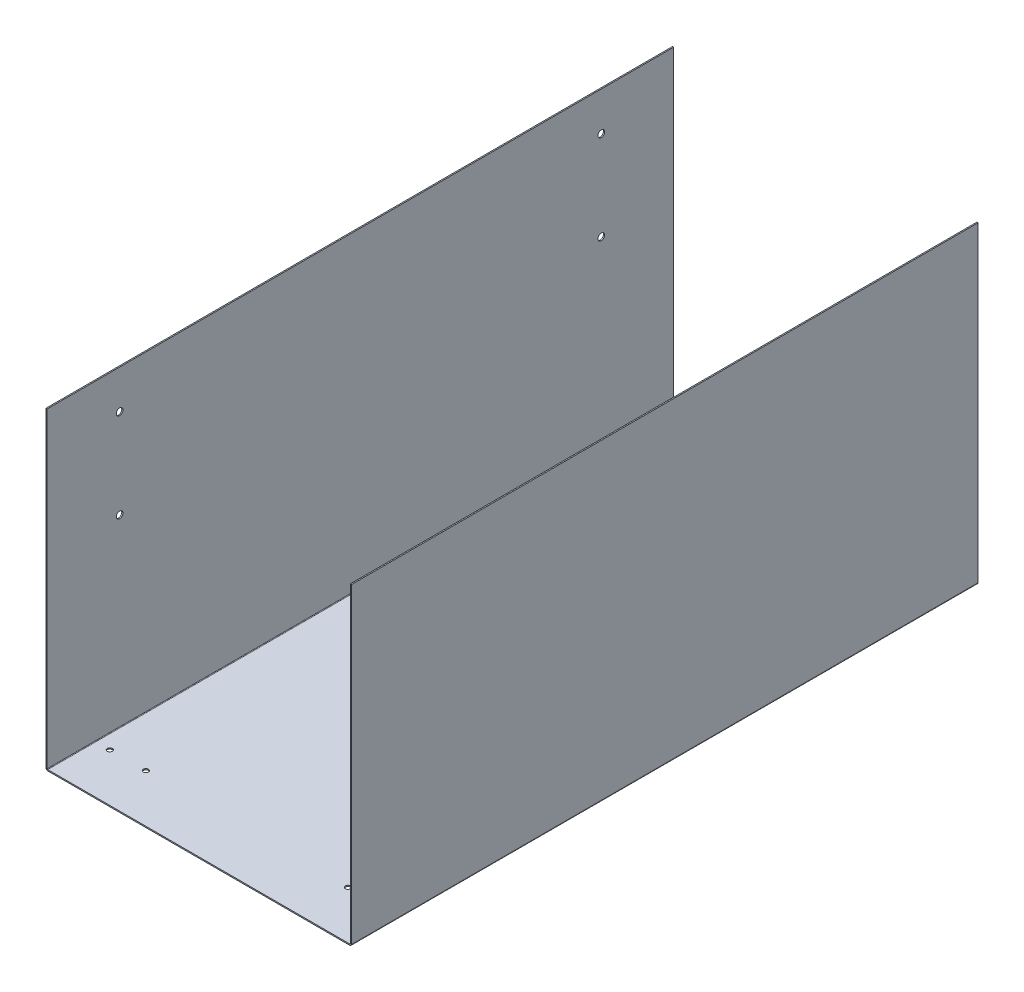
ISO-10303-21;
HEADER;
FILE_DESCRIPTION(('STEP AP214'),'2;1');
FILE_NAME('part.step','',(''),(''),'','','');
FILE_SCHEMA(('AUTOMOTIVE_DESIGN { 1 0 10303 214 1 1 1 1 }'));
ENDSEC;
DATA;
#1=APPLICATION_CONTEXT('core data for automotive mechanical design processes');
#2=APPLICATION_PROTOCOL_DEFINITION('international standard','automotive_design',2000,#1);
#3=PRODUCT_CONTEXT('',#1,'mechanical');
#4=PRODUCT('Part','Part','',(#3));
#5=PRODUCT_RELATED_PRODUCT_CATEGORY('part','',(#4));
#6=PRODUCT_DEFINITION_FORMATION('','',#4);
#7=PRODUCT_DEFINITION_CONTEXT('part definition',#1,'design');
#8=PRODUCT_DEFINITION('design','',#6,#7);
#9=PRODUCT_DEFINITION_SHAPE('','',#8);
#10=(LENGTH_UNIT() NAMED_UNIT(*) SI_UNIT(.MILLI.,.METRE.));
#11=(NAMED_UNIT(*) PLANE_ANGLE_UNIT() SI_UNIT($,.RADIAN.));
#12=(NAMED_UNIT(*) SI_UNIT($,.STERADIAN.) SOLID_ANGLE_UNIT());
#13=UNCERTAINTY_MEASURE_WITH_UNIT(LENGTH_MEASURE(1.E-05),#10,'distance_accuracy_value','');
#14=(GEOMETRIC_REPRESENTATION_CONTEXT(3) GLOBAL_UNCERTAINTY_ASSIGNED_CONTEXT((#13)) GLOBAL_UNIT_ASSIGNED_CONTEXT((#10,
#11,#12)) REPRESENTATION_CONTEXT('',''));
#15=CARTESIAN_POINT('',(0.,0.,0.));
#16=DIRECTION('',(0.,0.,1.));
#17=DIRECTION('',(1.,0.,0.));
#18=AXIS2_PLACEMENT_3D('',#15,#16,#17);
#19=CARTESIAN_POINT('',(192.7634,0.,400.));
#20=DIRECTION('',(0.,0.,1.));
#21=DIRECTION('',(1.,0.,0.));
#22=AXIS2_PLACEMENT_3D('',#19,#20,#21);
#23=PLANE('',#22);
#24=DIRECTION('',(0.,1.,0.));
#25=VECTOR('',#24,1.);
#26=CARTESIAN_POINT('',(192.7634,0.,400.));
#27=LINE('',#26,#25);
#28=CARTESIAN_POINT('',(192.7634,0.,400.));
#29=VERTEX_POINT('',#28);
#30=CARTESIAN_POINT('',(192.7634,1.50000000000007,400.));
#31=VERTEX_POINT('',#30);
#32=EDGE_CURVE('E11',#29,#31,#27,.T.);
#33=ORIENTED_EDGE('',*,*,#32,.F.);
#34=CARTESIAN_POINT('',(192.7634,2.23660000000007,400.));
#35=DIRECTION('',(0.,0.,1.));
#36=DIRECTION('',(1.,0.,0.));
#37=AXIS2_PLACEMENT_3D('',#34,#35,#36);
#38=CIRCLE('',#37,2.2366);
#39=CARTESIAN_POINT('',(195.,2.23660000000007,400.));
#40=VERTEX_POINT('',#39);
#41=EDGE_CURVE('E302',#40,#29,#38,.F.);
#42=ORIENTED_EDGE('',*,*,#41,.F.);
#43=DIRECTION('',(1.,0.,0.));
#44=VECTOR('',#43,1.);
#45=CARTESIAN_POINT('',(193.5,2.23660000000007,400.));
#46=LINE('',#45,#44);
#47=CARTESIAN_POINT('',(193.5,2.23660000000007,400.));
#48=VERTEX_POINT('',#47);
#49=EDGE_CURVE('E48',#48,#40,#46,.T.);
#50=ORIENTED_EDGE('',*,*,#49,.F.);
#51=CARTESIAN_POINT('',(192.7634,2.23660000000007,400.));
#52=DIRECTION('',(0.,0.,1.));
#53=DIRECTION('',(1.,0.,0.));
#54=AXIS2_PLACEMENT_3D('',#51,#52,#53);
#55=CIRCLE('',#54,0.7366);
#56=EDGE_CURVE('E150',#48,#31,#55,.F.);
#57=ORIENTED_EDGE('',*,*,#56,.T.);
#58=EDGE_LOOP('',(#33,#42,#50,#57));
#59=FACE_BOUND('',#58,.T.);
#60=ADVANCED_FACE('F39',(#59),#23,.T.);
#61=CARTESIAN_POINT('',(193.5,2.23660000000007,400.));
#62=DIRECTION('',(0.,0.,1.));
#63=DIRECTION('',(1.,0.,0.));
#64=AXIS2_PLACEMENT_3D('',#61,#62,#63);
#65=PLANE('',#64);
#66=DIRECTION('',(-1.,0.,0.));
#67=VECTOR('',#66,1.);
#68=CARTESIAN_POINT('',(-195.,0.,400.));
#69=LINE('',#68,#67);
#70=CARTESIAN_POINT('',(-192.7634,0.,400.));
#71=VERTEX_POINT('',#70);
#72=EDGE_CURVE('E144',#29,#71,#69,.T.);
#73=ORIENTED_EDGE('',*,*,#72,.F.);
#74=ORIENTED_EDGE('',*,*,#32,.T.);
#75=DIRECTION('',(-1.,0.,0.));
#76=VECTOR('',#75,1.);
#77=CARTESIAN_POINT('',(-195.,1.5,400.));
#78=LINE('',#77,#76);
#79=CARTESIAN_POINT('',(-192.7634,1.5,400.));
#80=VERTEX_POINT('',#79);
#81=EDGE_CURVE('E141',#31,#80,#78,.T.);
#82=ORIENTED_EDGE('',*,*,#81,.T.);
#83=DIRECTION('',(0.,-1.,0.));
#84=VECTOR('',#83,1.);
#85=CARTESIAN_POINT('',(-192.7634,1.5,400.));
#86=LINE('',#85,#84);
#87=EDGE_CURVE('E233',#80,#71,#86,.T.);
#88=ORIENTED_EDGE('',*,*,#87,.T.);
#89=EDGE_LOOP('',(#73,#74,#82,#88));
#90=FACE_BOUND('',#89,.T.);
#91=ADVANCED_FACE('F139',(#90),#65,.T.);
#92=CARTESIAN_POINT('',(195.,2.23660000000007,-400.));
#93=DIRECTION('',(0.,0.,-1.));
#94=DIRECTION('',(-1.,0.,0.));
#95=AXIS2_PLACEMENT_3D('',#92,#93,#94);
#96=PLANE('',#95);
#97=DIRECTION('',(-1.,0.,0.));
#98=VECTOR('',#97,1.);
#99=CARTESIAN_POINT('',(195.,2.23660000000007,-400.));
#100=LINE('',#99,#98);
#101=CARTESIAN_POINT('',(195.,2.23660000000007,-400.));
#102=VERTEX_POINT('',#101);
#103=CARTESIAN_POINT('',(193.5,2.23660000000007,-400.));
#104=VERTEX_POINT('',#103);
#105=EDGE_CURVE('E238',#102,#104,#100,.T.);
#106=ORIENTED_EDGE('',*,*,#105,.F.);
#107=CARTESIAN_POINT('',(192.7634,2.23660000000007,-400.));
#108=DIRECTION('',(0.,0.,1.));
#109=DIRECTION('',(1.,0.,0.));
#110=AXIS2_PLACEMENT_3D('',#107,#108,#109);
#111=CIRCLE('',#110,2.2366);
#112=CARTESIAN_POINT('',(192.7634,0.,-400.));
#113=VERTEX_POINT('',#112);
#114=EDGE_CURVE('E190',#102,#113,#111,.F.);
#115=ORIENTED_EDGE('',*,*,#114,.T.);
#116=DIRECTION('',(0.,-1.,0.));
#117=VECTOR('',#116,1.);
#118=CARTESIAN_POINT('',(192.7634,1.50000000000007,-400.));
#119=LINE('',#118,#117);
#120=CARTESIAN_POINT('',(192.7634,1.50000000000007,-400.));
#121=VERTEX_POINT('',#120);
#122=EDGE_CURVE('E236',#121,#113,#119,.T.);
#123=ORIENTED_EDGE('',*,*,#122,.F.);
#124=CARTESIAN_POINT('',(192.7634,2.23660000000007,-400.));
#125=DIRECTION('',(0.,0.,1.));
#126=DIRECTION('',(1.,0.,0.));
#127=AXIS2_PLACEMENT_3D('',#124,#125,#126);
#128=CIRCLE('',#127,0.7366);
#129=EDGE_CURVE('E162',#104,#121,#128,.F.);
#130=ORIENTED_EDGE('',*,*,#129,.F.);
#131=EDGE_LOOP('',(#106,#115,#123,#130));
#132=FACE_BOUND('',#131,.T.);
#133=ADVANCED_FACE('F320',(#132),#96,.T.);
#134=CARTESIAN_POINT('',(192.7634,1.50000000000007,-400.));
#135=DIRECTION('',(0.,0.,-1.));
#136=DIRECTION('',(-1.,0.,0.));
#137=AXIS2_PLACEMENT_3D('',#134,#135,#136);
#138=PLANE('',#137);
#139=DIRECTION('',(0.,-1.,0.));
#140=VECTOR('',#139,1.);
#141=CARTESIAN_POINT('',(195.,0.,-400.));
#142=LINE('',#141,#140);
#143=CARTESIAN_POINT('',(195.,400.,-400.));
#144=VERTEX_POINT('',#143);
#145=EDGE_CURVE('E193',#144,#102,#142,.T.);
#146=ORIENTED_EDGE('',*,*,#145,.T.);
#147=ORIENTED_EDGE('',*,*,#105,.T.);
#148=DIRECTION('',(0.,-1.,0.));
#149=VECTOR('',#148,1.);
#150=CARTESIAN_POINT('',(193.5,0.,-400.));
#151=LINE('',#150,#149);
#152=CARTESIAN_POINT('',(193.5,400.,-400.));
#153=VERTEX_POINT('',#152);
#154=EDGE_CURVE('E199',#153,#104,#151,.T.);
#155=ORIENTED_EDGE('',*,*,#154,.F.);
#156=DIRECTION('',(1.,0.,0.));
#157=VECTOR('',#156,1.);
#158=CARTESIAN_POINT('',(193.5,400.,-400.));
#159=LINE('',#158,#157);
#160=EDGE_CURVE('E196',#153,#144,#159,.T.);
#161=ORIENTED_EDGE('',*,*,#160,.T.);
#162=EDGE_LOOP('',(#146,#147,#155,#161));
#163=FACE_BOUND('',#162,.T.);
#164=ADVANCED_FACE('F368',(#163),#138,.T.);
#165=CARTESIAN_POINT('',(-195.,2.2366,400.));
#166=DIRECTION('',(0.,0.,1.));
#167=DIRECTION('',(1.,0.,0.));
#168=AXIS2_PLACEMENT_3D('',#165,#166,#167);
#169=PLANE('',#168);
#170=DIRECTION('',(1.,0.,0.));
#171=VECTOR('',#170,1.);
#172=CARTESIAN_POINT('',(-195.,2.2366,400.));
#173=LINE('',#172,#171);
#174=CARTESIAN_POINT('',(-195.,2.2366,400.));
#175=VERTEX_POINT('',#174);
#176=CARTESIAN_POINT('',(-193.5,2.2366,400.));
#177=VERTEX_POINT('',#176);
#178=EDGE_CURVE('E57',#175,#177,#173,.T.);
#179=ORIENTED_EDGE('',*,*,#178,.F.);
#180=CARTESIAN_POINT('',(-192.7634,2.2366,400.));
#181=DIRECTION('',(0.,0.,1.));
#182=DIRECTION('',(1.,0.,0.));
#183=AXIS2_PLACEMENT_3D('',#180,#181,#182);
#184=CIRCLE('',#183,2.2366);
#185=EDGE_CURVE('E298',#71,#175,#184,.F.);
#186=ORIENTED_EDGE('',*,*,#185,.F.);
#187=ORIENTED_EDGE('',*,*,#87,.F.);
#188=CARTESIAN_POINT('',(-192.7634,2.2366,400.));
#189=DIRECTION('',(0.,0.,1.));
#190=DIRECTION('',(1.,0.,0.));
#191=AXIS2_PLACEMENT_3D('',#188,#189,#190);
#192=CIRCLE('',#191,0.7366);
#193=EDGE_CURVE('E170',#80,#177,#192,.F.);
#194=ORIENTED_EDGE('',*,*,#193,.T.);
#195=EDGE_LOOP('',(#179,#186,#187,#194));
#196=FACE_BOUND('',#195,.T.);
#197=ADVANCED_FACE('F373',(#196),#169,.T.);
#198=CARTESIAN_POINT('',(-192.7634,1.5,400.));
#199=DIRECTION('',(0.,0.,1.));
#200=DIRECTION('',(1.,0.,0.));
#201=AXIS2_PLACEMENT_3D('',#198,#199,#200);
#202=PLANE('',#201);
#203=DIRECTION('',(0.,1.,0.));
#204=VECTOR('',#203,1.);
#205=CARTESIAN_POINT('',(-195.,0.,400.));
#206=LINE('',#205,#204);
#207=CARTESIAN_POINT('',(-195.,400.,400.));
#208=VERTEX_POINT('',#207);
#209=EDGE_CURVE('E295',#175,#208,#206,.T.);
#210=ORIENTED_EDGE('',*,*,#209,.F.);
#211=ORIENTED_EDGE('',*,*,#178,.T.);
#212=DIRECTION('',(0.,1.,0.));
#213=VECTOR('',#212,1.);
#214=CARTESIAN_POINT('',(-193.5,0.,400.));
#215=LINE('',#214,#213);
#216=CARTESIAN_POINT('',(-193.5,400.,400.));
#217=VERTEX_POINT('',#216);
#218=EDGE_CURVE('E111',#177,#217,#215,.T.);
#219=ORIENTED_EDGE('',*,*,#218,.T.);
#220=DIRECTION('',(1.,0.,0.));
#221=VECTOR('',#220,1.);
#222=CARTESIAN_POINT('',(-195.,400.,400.));
#223=LINE('',#222,#221);
#224=EDGE_CURVE('E292',#208,#217,#223,.T.);
#225=ORIENTED_EDGE('',*,*,#224,.F.);
#226=EDGE_LOOP('',(#210,#211,#219,#225));
#227=FACE_BOUND('',#226,.T.);
#228=ADVANCED_FACE('F347',(#227),#202,.T.);
#229=CARTESIAN_POINT('',(-192.7634,0.,-400.));
#230=DIRECTION('',(0.,0.,-1.));
#231=DIRECTION('',(-1.,0.,0.));
#232=AXIS2_PLACEMENT_3D('',#229,#230,#231);
#233=PLANE('',#232);
#234=DIRECTION('',(0.,1.,0.));
#235=VECTOR('',#234,1.);
#236=CARTESIAN_POINT('',(-192.7634,0.,-400.));
#237=LINE('',#236,#235);
#238=CARTESIAN_POINT('',(-192.7634,0.,-400.));
#239=VERTEX_POINT('',#238);
#240=CARTESIAN_POINT('',(-192.7634,1.5,-400.));
#241=VERTEX_POINT('',#240);
#242=EDGE_CURVE('E98',#239,#241,#237,.T.);
#243=ORIENTED_EDGE('',*,*,#242,.F.);
#244=CARTESIAN_POINT('',(-192.7634,2.2366,-400.));
#245=DIRECTION('',(0.,0.,1.));
#246=DIRECTION('',(1.,0.,0.));
#247=AXIS2_PLACEMENT_3D('',#244,#245,#246);
#248=CIRCLE('',#247,2.2366);
#249=CARTESIAN_POINT('',(-195.,2.2366,-400.));
#250=VERTEX_POINT('',#249);
#251=EDGE_CURVE('E186',#239,#250,#248,.F.);
#252=ORIENTED_EDGE('',*,*,#251,.T.);
#253=DIRECTION('',(-1.,0.,0.));
#254=VECTOR('',#253,1.);
#255=CARTESIAN_POINT('',(-193.5,2.2366,-400.));
#256=LINE('',#255,#254);
#257=CARTESIAN_POINT('',(-193.5,2.2366,-400.));
#258=VERTEX_POINT('',#257);
#259=EDGE_CURVE('E105',#258,#250,#256,.T.);
#260=ORIENTED_EDGE('',*,*,#259,.F.);
#261=CARTESIAN_POINT('',(-192.7634,2.2366,-400.));
#262=DIRECTION('',(0.,0.,1.));
#263=DIRECTION('',(1.,0.,0.));
#264=AXIS2_PLACEMENT_3D('',#261,#262,#263);
#265=CIRCLE('',#264,0.7366);
#266=EDGE_CURVE('E205',#241,#258,#265,.F.);
#267=ORIENTED_EDGE('',*,*,#266,.F.);
#268=EDGE_LOOP('',(#243,#252,#260,#267));
#269=FACE_BOUND('',#268,.T.);
#270=ADVANCED_FACE('F335',(#269),#233,.T.);
#271=CARTESIAN_POINT('',(-193.5,2.2366,-400.));
#272=DIRECTION('',(0.,0.,-1.));
#273=DIRECTION('',(-1.,0.,0.));
#274=AXIS2_PLACEMENT_3D('',#271,#272,#273);
#275=PLANE('',#274);
#276=DIRECTION('',(-1.,0.,0.));
#277=VECTOR('',#276,1.);
#278=CARTESIAN_POINT('',(-195.,0.,-400.));
#279=LINE('',#278,#277);
#280=EDGE_CURVE('E188',#113,#239,#279,.T.);
#281=ORIENTED_EDGE('',*,*,#280,.T.);
#282=ORIENTED_EDGE('',*,*,#242,.T.);
#283=DIRECTION('',(-1.,0.,0.));
#284=VECTOR('',#283,1.);
#285=CARTESIAN_POINT('',(-195.,1.5,-400.));
#286=LINE('',#285,#284);
#287=EDGE_CURVE('E203',#121,#241,#286,.T.);
#288=ORIENTED_EDGE('',*,*,#287,.F.);
#289=ORIENTED_EDGE('',*,*,#122,.T.);
#290=EDGE_LOOP('',(#281,#282,#288,#289));
#291=FACE_BOUND('',#290,.T.);
#292=ADVANCED_FACE('F322',(#291),#275,.T.);
#293=CARTESIAN_POINT('',(-193.5,0.,400.));
#294=DIRECTION('',(-1.,0.,0.));
#295=DIRECTION('',(0.,0.,1.));
#296=AXIS2_PLACEMENT_3D('',#293,#294,#295);
#297=PLANE('',#296);
#298=CARTESIAN_POINT('',(-193.5,350.5,307.500000000001));
#299=DIRECTION('',(1.,0.,0.));
#300=DIRECTION('',(0.,0.,1.));
#301=AXIS2_PLACEMENT_3D('',#298,#299,#300);
#302=CIRCLE('',#301,4.25000000000001);
#303=CARTESIAN_POINT('',(-193.5,350.5,311.750000000001));
#304=VERTEX_POINT('',#303);
#305=EDGE_CURVE('E276',#304,#304,#302,.T.);
#306=ORIENTED_EDGE('',*,*,#305,.F.);
#307=EDGE_LOOP('',(#306));
#308=FACE_BOUND('',#307,.T.);
#309=CARTESIAN_POINT('',(-193.5,236.5,307.500000000001));
#310=DIRECTION('',(1.,0.,0.));
#311=DIRECTION('',(0.,0.,1.));
#312=AXIS2_PLACEMENT_3D('',#309,#310,#311);
#313=CIRCLE('',#312,4.24999999999995);
#314=CARTESIAN_POINT('',(-193.5,236.5,311.750000000001));
#315=VERTEX_POINT('',#314);
#316=EDGE_CURVE('E280',#315,#315,#313,.T.);
#317=ORIENTED_EDGE('',*,*,#316,.F.);
#318=EDGE_LOOP('',(#317));
#319=FACE_BOUND('',#318,.T.);
#320=CARTESIAN_POINT('',(-193.5,236.5,-307.500000000001));
#321=DIRECTION('',(1.,0.,0.));
#322=DIRECTION('',(0.,0.,-1.));
#323=AXIS2_PLACEMENT_3D('',#320,#321,#322);
#324=CIRCLE('',#323,4.24999999999995);
#325=CARTESIAN_POINT('',(-193.5,236.5,-311.750000000001));
#326=VERTEX_POINT('',#325);
#327=EDGE_CURVE('E285',#326,#326,#324,.T.);
#328=ORIENTED_EDGE('',*,*,#327,.F.);
#329=EDGE_LOOP('',(#328));
#330=FACE_BOUND('',#329,.T.);
#331=CARTESIAN_POINT('',(-193.5,350.5,-307.500000000001));
#332=DIRECTION('',(1.,0.,0.));
#333=DIRECTION('',(0.,0.,-1.));
#334=AXIS2_PLACEMENT_3D('',#331,#332,#333);
#335=CIRCLE('',#334,4.25000000000001);
#336=CARTESIAN_POINT('',(-193.5,350.5,-311.750000000001));
#337=VERTEX_POINT('',#336);
#338=EDGE_CURVE('E245',#337,#337,#335,.T.);
#339=ORIENTED_EDGE('',*,*,#338,.F.);
#340=EDGE_LOOP('',(#339));
#341=FACE_BOUND('',#340,.T.);
#342=DIRECTION('',(0.,1.,0.));
#343=VECTOR('',#342,1.);
#344=CARTESIAN_POINT('',(-193.5,0.,-400.));
#345=LINE('',#344,#343);
#346=CARTESIAN_POINT('',(-193.5,400.,-400.));
#347=VERTEX_POINT('',#346);
#348=EDGE_CURVE('E176',#258,#347,#345,.T.);
#349=ORIENTED_EDGE('',*,*,#348,.T.);
#350=DIRECTION('',(0.,0.,-1.));
#351=VECTOR('',#350,1.);
#352=CARTESIAN_POINT('',(-193.5,400.,400.));
#353=LINE('',#352,#351);
#354=EDGE_CURVE('E229',#217,#347,#353,.T.);
#355=ORIENTED_EDGE('',*,*,#354,.F.);
#356=ORIENTED_EDGE('',*,*,#218,.F.);
#357=DIRECTION('',(0.,0.,-1.));
#358=VECTOR('',#357,1.);
#359=CARTESIAN_POINT('',(-193.5,2.2366,400.));
#360=LINE('',#359,#358);
#361=EDGE_CURVE('E172',#177,#258,#360,.T.);
#362=ORIENTED_EDGE('',*,*,#361,.T.);
#363=EDGE_LOOP('',(#349,#355,#356,#362));
#364=FACE_BOUND('',#363,.T.);
#365=ADVANCED_FACE('F341',(#308,#319,#330,#341,#364),#297,.F.);
#366=CARTESIAN_POINT('',(-195.,400.,400.));
#367=DIRECTION('',(0.,1.,0.));
#368=DIRECTION('',(0.,0.,1.));
#369=AXIS2_PLACEMENT_3D('',#366,#367,#368);
#370=PLANE('',#369);
#371=DIRECTION('',(1.,0.,0.));
#372=VECTOR('',#371,1.);
#373=CARTESIAN_POINT('',(-195.,400.,-400.));
#374=LINE('',#373,#372);
#375=CARTESIAN_POINT('',(-195.,400.,-400.));
#376=VERTEX_POINT('',#375);
#377=EDGE_CURVE('E179',#376,#347,#374,.T.);
#378=ORIENTED_EDGE('',*,*,#377,.F.);
#379=DIRECTION('',(0.,0.,-1.));
#380=VECTOR('',#379,1.);
#381=CARTESIAN_POINT('',(-195.,400.,400.));
#382=LINE('',#381,#380);
#383=EDGE_CURVE('E227',#208,#376,#382,.T.);
#384=ORIENTED_EDGE('',*,*,#383,.F.);
#385=ORIENTED_EDGE('',*,*,#224,.T.);
#386=ORIENTED_EDGE('',*,*,#354,.T.);
#387=EDGE_LOOP('',(#378,#384,#385,#386));
#388=FACE_BOUND('',#387,.T.);
#389=ADVANCED_FACE('F346',(#388),#370,.T.);
#390=CARTESIAN_POINT('',(-195.,0.,400.));
#391=DIRECTION('',(-1.,0.,0.));
#392=DIRECTION('',(0.,0.,1.));
#393=AXIS2_PLACEMENT_3D('',#390,#391,#392);
#394=PLANE('',#393);
#395=CARTESIAN_POINT('',(-195.,350.5,307.500000000001));
#396=DIRECTION('',(-1.,0.,0.));
#397=DIRECTION('',(0.,0.,1.));
#398=AXIS2_PLACEMENT_3D('',#395,#396,#397);
#399=CIRCLE('',#398,4.25000000000001);
#400=CARTESIAN_POINT('',(-195.,350.5,311.750000000001));
#401=VERTEX_POINT('',#400);
#402=EDGE_CURVE('E180',#401,#401,#399,.T.);
#403=ORIENTED_EDGE('',*,*,#402,.F.);
#404=EDGE_LOOP('',(#403));
#405=FACE_BOUND('',#404,.T.);
#406=CARTESIAN_POINT('',(-195.,236.5,307.500000000001));
#407=DIRECTION('',(-1.,0.,0.));
#408=DIRECTION('',(0.,0.,1.));
#409=AXIS2_PLACEMENT_3D('',#406,#407,#408);
#410=CIRCLE('',#409,4.24999999999995);
#411=CARTESIAN_POINT('',(-195.,236.5,311.750000000001));
#412=VERTEX_POINT('',#411);
#413=EDGE_CURVE('E248',#412,#412,#410,.T.);
#414=ORIENTED_EDGE('',*,*,#413,.F.);
#415=EDGE_LOOP('',(#414));
#416=FACE_BOUND('',#415,.T.);
#417=CARTESIAN_POINT('',(-195.,236.5,-307.500000000001));
#418=DIRECTION('',(-1.,0.,0.));
#419=DIRECTION('',(0.,0.,1.));
#420=AXIS2_PLACEMENT_3D('',#417,#418,#419);
#421=CIRCLE('',#420,4.24999999999995);
#422=CARTESIAN_POINT('',(-195.,236.5,-303.250000000001));
#423=VERTEX_POINT('',#422);
#424=EDGE_CURVE('E244',#423,#423,#421,.T.);
#425=ORIENTED_EDGE('',*,*,#424,.F.);
#426=EDGE_LOOP('',(#425));
#427=FACE_BOUND('',#426,.T.);
#428=CARTESIAN_POINT('',(-195.,350.5,-307.500000000001));
#429=DIRECTION('',(-1.,0.,0.));
#430=DIRECTION('',(0.,0.,1.));
#431=AXIS2_PLACEMENT_3D('',#428,#429,#430);
#432=CIRCLE('',#431,4.25000000000001);
#433=CARTESIAN_POINT('',(-195.,350.5,-303.250000000001));
#434=VERTEX_POINT('',#433);
#435=EDGE_CURVE('E241',#434,#434,#432,.T.);
#436=ORIENTED_EDGE('',*,*,#435,.F.);
#437=EDGE_LOOP('',(#436));
#438=FACE_BOUND('',#437,.T.);
#439=DIRECTION('',(0.,1.,0.));
#440=VECTOR('',#439,1.);
#441=CARTESIAN_POINT('',(-195.,0.,-400.));
#442=LINE('',#441,#440);
#443=EDGE_CURVE('E183',#250,#376,#442,.T.);
#444=ORIENTED_EDGE('',*,*,#443,.F.);
#445=DIRECTION('',(0.,0.,-1.));
#446=VECTOR('',#445,1.);
#447=CARTESIAN_POINT('',(-195.,2.2366,400.));
#448=LINE('',#447,#446);
#449=EDGE_CURVE('E224',#175,#250,#448,.T.);
#450=ORIENTED_EDGE('',*,*,#449,.F.);
#451=ORIENTED_EDGE('',*,*,#209,.T.);
#452=ORIENTED_EDGE('',*,*,#383,.T.);
#453=EDGE_LOOP('',(#444,#450,#451,#452));
#454=FACE_BOUND('',#453,.T.);
#455=ADVANCED_FACE('F349',(#405,#416,#427,#438,#454),#394,.T.);
#456=CARTESIAN_POINT('',(-192.7634,2.2366,400.));
#457=DIRECTION('',(0.,0.,-1.));
#458=DIRECTION('',(-1.,0.,0.));
#459=AXIS2_PLACEMENT_3D('',#456,#457,#458);
#460=CYLINDRICAL_SURFACE('',#459,2.2366);
#461=ORIENTED_EDGE('',*,*,#251,.F.);
#462=DIRECTION('',(0.,0.,-1.));
#463=VECTOR('',#462,1.);
#464=CARTESIAN_POINT('',(-192.7634,0.,400.));
#465=LINE('',#464,#463);
#466=EDGE_CURVE('E221',#71,#239,#465,.T.);
#467=ORIENTED_EDGE('',*,*,#466,.F.);
#468=ORIENTED_EDGE('',*,*,#185,.T.);
#469=ORIENTED_EDGE('',*,*,#449,.T.);
#470=EDGE_LOOP('',(#461,#467,#468,#469));
#471=FACE_BOUND('',#470,.T.);
#472=ADVANCED_FACE('F332',(#471),#460,.T.);
#473=CARTESIAN_POINT('',(-195.,0.,400.));
#474=DIRECTION('',(0.,-1.,0.));
#475=DIRECTION('',(1.,0.,0.));
#476=AXIS2_PLACEMENT_3D('',#473,#474,#475);
#477=PLANE('',#476);
#478=CARTESIAN_POINT('',(-175.,0.,-338.5));
#479=DIRECTION('',(0.,-1.,0.));
#480=DIRECTION('',(-1.,0.,0.));
#481=AXIS2_PLACEMENT_3D('',#478,#479,#480);
#482=CIRCLE('',#481,3.25000000000001);
#483=CARTESIAN_POINT('',(-178.25,0.,-338.5));
#484=VERTEX_POINT('',#483);
#485=EDGE_CURVE('E440',#484,#484,#482,.T.);
#486=ORIENTED_EDGE('',*,*,#485,.F.);
#487=EDGE_LOOP('',(#486));
#488=FACE_BOUND('',#487,.T.);
#489=CARTESIAN_POINT('',(129.,0.,338.5));
#490=DIRECTION('',(0.,-1.,0.));
#491=DIRECTION('',(-1.,0.,0.));
#492=AXIS2_PLACEMENT_3D('',#489,#490,#491);
#493=CIRCLE('',#492,3.25000000000003);
#494=CARTESIAN_POINT('',(125.75,0.,338.5));
#495=VERTEX_POINT('',#494);
#496=EDGE_CURVE('E444',#495,#495,#493,.T.);
#497=ORIENTED_EDGE('',*,*,#496,.F.);
#498=EDGE_LOOP('',(#497));
#499=FACE_BOUND('',#498,.T.);
#500=CARTESIAN_POINT('',(175.,0.,338.5));
#501=DIRECTION('',(0.,-1.,0.));
#502=DIRECTION('',(-1.,0.,0.));
#503=AXIS2_PLACEMENT_3D('',#500,#501,#502);
#504=CIRCLE('',#503,3.25000000000001);
#505=CARTESIAN_POINT('',(171.75,0.,338.5));
#506=VERTEX_POINT('',#505);
#507=EDGE_CURVE('E448',#506,#506,#504,.T.);
#508=ORIENTED_EDGE('',*,*,#507,.F.);
#509=EDGE_LOOP('',(#508));
#510=FACE_BOUND('',#509,.T.);
#511=CARTESIAN_POINT('',(-129.,0.,338.5));
#512=DIRECTION('',(0.,-1.,0.));
#513=DIRECTION('',(1.,0.,0.));
#514=AXIS2_PLACEMENT_3D('',#511,#512,#513);
#515=CIRCLE('',#514,3.25000000000003);
#516=CARTESIAN_POINT('',(-125.75,0.,338.5));
#517=VERTEX_POINT('',#516);
#518=EDGE_CURVE('E452',#517,#517,#515,.T.);
#519=ORIENTED_EDGE('',*,*,#518,.F.);
#520=EDGE_LOOP('',(#519));
#521=FACE_BOUND('',#520,.T.);
#522=CARTESIAN_POINT('',(-129.,0.,-338.5));
#523=DIRECTION('',(0.,-1.,0.));
#524=DIRECTION('',(-1.,0.,0.));
#525=AXIS2_PLACEMENT_3D('',#522,#523,#524);
#526=CIRCLE('',#525,3.25000000000003);
#527=CARTESIAN_POINT('',(-132.25,0.,-338.5));
#528=VERTEX_POINT('',#527);
#529=EDGE_CURVE('E456',#528,#528,#526,.T.);
#530=ORIENTED_EDGE('',*,*,#529,.F.);
#531=EDGE_LOOP('',(#530));
#532=FACE_BOUND('',#531,.T.);
#533=CARTESIAN_POINT('',(129.,0.,-338.5));
#534=DIRECTION('',(0.,-1.,0.));
#535=DIRECTION('',(1.,0.,0.));
#536=AXIS2_PLACEMENT_3D('',#533,#534,#535);
#537=CIRCLE('',#536,3.25000000000003);
#538=CARTESIAN_POINT('',(132.25,0.,-338.5));
#539=VERTEX_POINT('',#538);
#540=EDGE_CURVE('E460',#539,#539,#537,.T.);
#541=ORIENTED_EDGE('',*,*,#540,.F.);
#542=EDGE_LOOP('',(#541));
#543=FACE_BOUND('',#542,.T.);
#544=CARTESIAN_POINT('',(175.,0.,-338.5));
#545=DIRECTION('',(0.,-1.,0.));
#546=DIRECTION('',(1.,0.,0.));
#547=AXIS2_PLACEMENT_3D('',#544,#545,#546);
#548=CIRCLE('',#547,3.25000000000001);
#549=CARTESIAN_POINT('',(178.25,0.,-338.5));
#550=VERTEX_POINT('',#549);
#551=EDGE_CURVE('E464',#550,#550,#548,.T.);
#552=ORIENTED_EDGE('',*,*,#551,.F.);
#553=EDGE_LOOP('',(#552));
#554=FACE_BOUND('',#553,.T.);
#555=CARTESIAN_POINT('',(-175.,0.,338.5));
#556=DIRECTION('',(0.,-1.,0.));
#557=DIRECTION('',(1.,0.,0.));
#558=AXIS2_PLACEMENT_3D('',#555,#556,#557);
#559=CIRCLE('',#558,3.25000000000001);
#560=CARTESIAN_POINT('',(-171.75,0.,338.5));
#561=VERTEX_POINT('',#560);
#562=EDGE_CURVE('E257',#561,#561,#559,.T.);
#563=ORIENTED_EDGE('',*,*,#562,.F.);
#564=EDGE_LOOP('',(#563));
#565=FACE_BOUND('',#564,.T.);
#566=ORIENTED_EDGE('',*,*,#280,.F.);
#567=DIRECTION('',(0.,0.,-1.));
#568=VECTOR('',#567,1.);
#569=CARTESIAN_POINT('',(192.7634,0.,400.));
#570=LINE('',#569,#568);
#571=EDGE_CURVE('E218',#29,#113,#570,.T.);
#572=ORIENTED_EDGE('',*,*,#571,.F.);
#573=ORIENTED_EDGE('',*,*,#72,.T.);
#574=ORIENTED_EDGE('',*,*,#466,.T.);
#575=EDGE_LOOP('',(#566,#572,#573,#574));
#576=FACE_BOUND('',#575,.T.);
#577=ADVANCED_FACE('F327',(#488,#499,#510,#521,#532,#543,#554,#565,#576),#477,.T.);
#578=CARTESIAN_POINT('',(192.7634,2.23660000000007,400.));
#579=DIRECTION('',(0.,0.,-1.));
#580=DIRECTION('',(-1.,0.,0.));
#581=AXIS2_PLACEMENT_3D('',#578,#579,#580);
#582=CYLINDRICAL_SURFACE('',#581,2.2366);
#583=ORIENTED_EDGE('',*,*,#114,.F.);
#584=DIRECTION('',(0.,0.,-1.));
#585=VECTOR('',#584,1.);
#586=CARTESIAN_POINT('',(195.,2.23660000000007,400.));
#587=LINE('',#586,#585);
#588=EDGE_CURVE('E215',#40,#102,#587,.T.);
#589=ORIENTED_EDGE('',*,*,#588,.F.);
#590=ORIENTED_EDGE('',*,*,#41,.T.);
#591=ORIENTED_EDGE('',*,*,#571,.T.);
#592=EDGE_LOOP('',(#583,#589,#590,#591));
#593=FACE_BOUND('',#592,.T.);
#594=ADVANCED_FACE('F325',(#593),#582,.T.);
#595=CARTESIAN_POINT('',(195.,0.,400.));
#596=DIRECTION('',(1.,0.,0.));
#597=DIRECTION('',(0.,1.,0.));
#598=AXIS2_PLACEMENT_3D('',#595,#596,#597);
#599=PLANE('',#598);
#600=ORIENTED_EDGE('',*,*,#145,.F.);
#601=DIRECTION('',(0.,0.,-1.));
#602=VECTOR('',#601,1.);
#603=CARTESIAN_POINT('',(195.,400.,400.));
#604=LINE('',#603,#602);
#605=CARTESIAN_POINT('',(195.,400.,400.));
#606=VERTEX_POINT('',#605);
#607=EDGE_CURVE('E213',#606,#144,#604,.T.);
#608=ORIENTED_EDGE('',*,*,#607,.F.);
#609=DIRECTION('',(0.,-1.,0.));
#610=VECTOR('',#609,1.);
#611=CARTESIAN_POINT('',(195.,0.,400.));
#612=LINE('',#611,#610);
#613=EDGE_CURVE('E304',#606,#40,#612,.T.);
#614=ORIENTED_EDGE('',*,*,#613,.T.);
#615=ORIENTED_EDGE('',*,*,#588,.T.);
#616=EDGE_LOOP('',(#600,#608,#614,#615));
#617=FACE_BOUND('',#616,.T.);
#618=ADVANCED_FACE('F426',(#617),#599,.T.);
#619=CARTESIAN_POINT('',(193.5,400.,400.));
#620=DIRECTION('',(0.,1.,0.));
#621=DIRECTION('',(0.,0.,1.));
#622=AXIS2_PLACEMENT_3D('',#619,#620,#621);
#623=PLANE('',#622);
#624=ORIENTED_EDGE('',*,*,#160,.F.);
#625=DIRECTION('',(0.,0.,-1.));
#626=VECTOR('',#625,1.);
#627=CARTESIAN_POINT('',(193.5,400.,400.));
#628=LINE('',#627,#626);
#629=CARTESIAN_POINT('',(193.5,400.,400.));
#630=VERTEX_POINT('',#629);
#631=EDGE_CURVE('E211',#630,#153,#628,.T.);
#632=ORIENTED_EDGE('',*,*,#631,.F.);
#633=DIRECTION('',(1.,0.,0.));
#634=VECTOR('',#633,1.);
#635=CARTESIAN_POINT('',(193.5,400.,400.));
#636=LINE('',#635,#634);
#637=EDGE_CURVE('E307',#630,#606,#636,.T.);
#638=ORIENTED_EDGE('',*,*,#637,.T.);
#639=ORIENTED_EDGE('',*,*,#607,.T.);
#640=EDGE_LOOP('',(#624,#632,#638,#639));
#641=FACE_BOUND('',#640,.T.);
#642=ADVANCED_FACE('F423',(#641),#623,.T.);
#643=CARTESIAN_POINT('',(193.5,0.,400.));
#644=DIRECTION('',(1.,0.,0.));
#645=DIRECTION('',(0.,1.,0.));
#646=AXIS2_PLACEMENT_3D('',#643,#644,#645);
#647=PLANE('',#646);
#648=ORIENTED_EDGE('',*,*,#154,.T.);
#649=DIRECTION('',(0.,0.,-1.));
#650=VECTOR('',#649,1.);
#651=CARTESIAN_POINT('',(193.5,2.23660000000007,400.));
#652=LINE('',#651,#650);
#653=EDGE_CURVE('E164',#48,#104,#652,.T.);
#654=ORIENTED_EDGE('',*,*,#653,.F.);
#655=DIRECTION('',(0.,-1.,0.));
#656=VECTOR('',#655,1.);
#657=CARTESIAN_POINT('',(193.5,0.,400.));
#658=LINE('',#657,#656);
#659=EDGE_CURVE('E155',#630,#48,#658,.T.);
#660=ORIENTED_EDGE('',*,*,#659,.F.);
#661=ORIENTED_EDGE('',*,*,#631,.T.);
#662=EDGE_LOOP('',(#648,#654,#660,#661));
#663=FACE_BOUND('',#662,.T.);
#664=ADVANCED_FACE('F317',(#663),#647,.F.);
#665=CARTESIAN_POINT('',(192.7634,2.23660000000007,400.));
#666=DIRECTION('',(0.,0.,-1.));
#667=DIRECTION('',(-1.,0.,0.));
#668=AXIS2_PLACEMENT_3D('',#665,#666,#667);
#669=CYLINDRICAL_SURFACE('',#668,0.7366);
#670=ORIENTED_EDGE('',*,*,#129,.T.);
#671=DIRECTION('',(0.,0.,-1.));
#672=VECTOR('',#671,1.);
#673=CARTESIAN_POINT('',(192.7634,1.50000000000007,400.));
#674=LINE('',#673,#672);
#675=EDGE_CURVE('E159',#31,#121,#674,.T.);
#676=ORIENTED_EDGE('',*,*,#675,.F.);
#677=ORIENTED_EDGE('',*,*,#56,.F.);
#678=ORIENTED_EDGE('',*,*,#653,.T.);
#679=EDGE_LOOP('',(#670,#676,#677,#678));
#680=FACE_BOUND('',#679,.T.);
#681=ADVANCED_FACE('F160',(#680),#669,.F.);
#682=CARTESIAN_POINT('',(-195.,1.5,400.));
#683=DIRECTION('',(0.,-1.,0.));
#684=DIRECTION('',(1.,0.,0.));
#685=AXIS2_PLACEMENT_3D('',#682,#683,#684);
#686=PLANE('',#685);
#687=CARTESIAN_POINT('',(-175.,1.5,-338.5));
#688=DIRECTION('',(0.,-1.,0.));
#689=DIRECTION('',(1.,0.,0.));
#690=AXIS2_PLACEMENT_3D('',#687,#688,#689);
#691=CIRCLE('',#690,3.25000000000001);
#692=CARTESIAN_POINT('',(-171.75,1.5,-338.5));
#693=VERTEX_POINT('',#692);
#694=EDGE_CURVE('E42',#693,#693,#691,.T.);
#695=ORIENTED_EDGE('',*,*,#694,.T.);
#696=EDGE_LOOP('',(#695));
#697=FACE_BOUND('',#696,.T.);
#698=CARTESIAN_POINT('',(129.,1.50000000000006,338.5));
#699=DIRECTION('',(0.,-1.,0.));
#700=DIRECTION('',(1.,0.,0.));
#701=AXIS2_PLACEMENT_3D('',#698,#699,#700);
#702=CIRCLE('',#701,3.25000000000003);
#703=CARTESIAN_POINT('',(132.25,1.50000000000006,338.5));
#704=VERTEX_POINT('',#703);
#705=EDGE_CURVE('E271',#704,#704,#702,.T.);
#706=ORIENTED_EDGE('',*,*,#705,.T.);
#707=EDGE_LOOP('',(#706));
#708=FACE_BOUND('',#707,.T.);
#709=CARTESIAN_POINT('',(175.,1.50000000000007,338.5));
#710=DIRECTION('',(0.,-1.,0.));
#711=DIRECTION('',(1.,0.,0.));
#712=AXIS2_PLACEMENT_3D('',#709,#710,#711);
#713=CIRCLE('',#712,3.25000000000001);
#714=CARTESIAN_POINT('',(178.25,1.50000000000007,338.5));
#715=VERTEX_POINT('',#714);
#716=EDGE_CURVE('E269',#715,#715,#713,.T.);
#717=ORIENTED_EDGE('',*,*,#716,.T.);
#718=EDGE_LOOP('',(#717));
#719=FACE_BOUND('',#718,.T.);
#720=CARTESIAN_POINT('',(-129.,1.50000000000001,338.5));
#721=DIRECTION('',(0.,-1.,0.));
#722=DIRECTION('',(1.,0.,0.));
#723=AXIS2_PLACEMENT_3D('',#720,#721,#722);
#724=CIRCLE('',#723,3.25000000000003);
#725=CARTESIAN_POINT('',(-125.75,1.50000000000001,338.5));
#726=VERTEX_POINT('',#725);
#727=EDGE_CURVE('E266',#726,#726,#724,.T.);
#728=ORIENTED_EDGE('',*,*,#727,.T.);
#729=EDGE_LOOP('',(#728));
#730=FACE_BOUND('',#729,.T.);
#731=CARTESIAN_POINT('',(-129.,1.50000000000001,-338.5));
#732=DIRECTION('',(0.,-1.,0.));
#733=DIRECTION('',(1.,0.,0.));
#734=AXIS2_PLACEMENT_3D('',#731,#732,#733);
#735=CIRCLE('',#734,3.25000000000003);
#736=CARTESIAN_POINT('',(-125.75,1.50000000000001,-338.5));
#737=VERTEX_POINT('',#736);
#738=EDGE_CURVE('E263',#737,#737,#735,.T.);
#739=ORIENTED_EDGE('',*,*,#738,.T.);
#740=EDGE_LOOP('',(#739));
#741=FACE_BOUND('',#740,.T.);
#742=CARTESIAN_POINT('',(129.,1.50000000000006,-338.5));
#743=DIRECTION('',(0.,-1.,0.));
#744=DIRECTION('',(1.,0.,0.));
#745=AXIS2_PLACEMENT_3D('',#742,#743,#744);
#746=CIRCLE('',#745,3.25000000000003);
#747=CARTESIAN_POINT('',(132.25,1.50000000000006,-338.5));
#748=VERTEX_POINT('',#747);
#749=EDGE_CURVE('E260',#748,#748,#746,.T.);
#750=ORIENTED_EDGE('',*,*,#749,.T.);
#751=EDGE_LOOP('',(#750));
#752=FACE_BOUND('',#751,.T.);
#753=CARTESIAN_POINT('',(175.,1.50000000000007,-338.5));
#754=DIRECTION('',(0.,-1.,0.));
#755=DIRECTION('',(1.,0.,0.));
#756=AXIS2_PLACEMENT_3D('',#753,#754,#755);
#757=CIRCLE('',#756,3.25000000000001);
#758=CARTESIAN_POINT('',(178.25,1.50000000000007,-338.5));
#759=VERTEX_POINT('',#758);
#760=EDGE_CURVE('E256',#759,#759,#757,.T.);
#761=ORIENTED_EDGE('',*,*,#760,.T.);
#762=EDGE_LOOP('',(#761));
#763=FACE_BOUND('',#762,.T.);
#764=CARTESIAN_POINT('',(-175.,1.5,338.5));
#765=DIRECTION('',(0.,-1.,0.));
#766=DIRECTION('',(1.,0.,0.));
#767=AXIS2_PLACEMENT_3D('',#764,#765,#766);
#768=CIRCLE('',#767,3.25000000000001);
#769=CARTESIAN_POINT('',(-171.75,1.5,338.5));
#770=VERTEX_POINT('',#769);
#771=EDGE_CURVE('E253',#770,#770,#768,.T.);
#772=ORIENTED_EDGE('',*,*,#771,.T.);
#773=EDGE_LOOP('',(#772));
#774=FACE_BOUND('',#773,.T.);
#775=ORIENTED_EDGE('',*,*,#287,.T.);
#776=DIRECTION('',(0.,0.,-1.));
#777=VECTOR('',#776,1.);
#778=CARTESIAN_POINT('',(-192.7634,1.5,400.));
#779=LINE('',#778,#777);
#780=EDGE_CURVE('E165',#80,#241,#779,.T.);
#781=ORIENTED_EDGE('',*,*,#780,.F.);
#782=ORIENTED_EDGE('',*,*,#81,.F.);
#783=ORIENTED_EDGE('',*,*,#675,.T.);
#784=EDGE_LOOP('',(#775,#781,#782,#783));
#785=FACE_BOUND('',#784,.T.);
#786=ADVANCED_FACE('F167',(#697,#708,#719,#730,#741,#752,#763,#774,#785),#686,.F.);
#787=CARTESIAN_POINT('',(-192.7634,2.2366,400.));
#788=DIRECTION('',(0.,0.,-1.));
#789=DIRECTION('',(-1.,0.,0.));
#790=AXIS2_PLACEMENT_3D('',#787,#788,#789);
#791=CYLINDRICAL_SURFACE('',#790,0.7366);
#792=ORIENTED_EDGE('',*,*,#266,.T.);
#793=ORIENTED_EDGE('',*,*,#361,.F.);
#794=ORIENTED_EDGE('',*,*,#193,.F.);
#795=ORIENTED_EDGE('',*,*,#780,.T.);
#796=EDGE_LOOP('',(#792,#793,#794,#795));
#797=FACE_BOUND('',#796,.T.);
#798=ADVANCED_FACE('F338',(#797),#791,.F.);
#799=CARTESIAN_POINT('',(-192.7634,2.2366,400.));
#800=DIRECTION('',(0.,0.,1.));
#801=DIRECTION('',(1.,0.,0.));
#802=AXIS2_PLACEMENT_3D('',#799,#800,#801);
#803=PLANE('',#802);
#804=ORIENTED_EDGE('',*,*,#659,.T.);
#805=ORIENTED_EDGE('',*,*,#49,.T.);
#806=ORIENTED_EDGE('',*,*,#613,.F.);
#807=ORIENTED_EDGE('',*,*,#637,.F.);
#808=EDGE_LOOP('',(#804,#805,#806,#807));
#809=FACE_BOUND('',#808,.T.);
#810=ADVANCED_FACE('F313',(#809),#803,.T.);
#811=CARTESIAN_POINT('',(-192.7634,2.2366,-400.));
#812=DIRECTION('',(0.,0.,1.));
#813=DIRECTION('',(1.,0.,0.));
#814=AXIS2_PLACEMENT_3D('',#811,#812,#813);
#815=PLANE('',#814);
#816=ORIENTED_EDGE('',*,*,#348,.F.);
#817=ORIENTED_EDGE('',*,*,#259,.T.);
#818=ORIENTED_EDGE('',*,*,#443,.T.);
#819=ORIENTED_EDGE('',*,*,#377,.T.);
#820=EDGE_LOOP('',(#816,#817,#818,#819));
#821=FACE_BOUND('',#820,.T.);
#822=ADVANCED_FACE('F343',(#821),#815,.F.);
#823=CARTESIAN_POINT('',(-203.5,350.5,-307.500000000001));
#824=DIRECTION('',(1.,0.,0.));
#825=DIRECTION('',(0.,0.,-1.));
#826=AXIS2_PLACEMENT_3D('',#823,#824,#825);
#827=CYLINDRICAL_SURFACE('',#826,4.25000000000001);
#828=ORIENTED_EDGE('',*,*,#435,.T.);
#829=EDGE_LOOP('',(#828));
#830=FACE_BOUND('',#829,.T.);
#831=ORIENTED_EDGE('',*,*,#338,.T.);
#832=EDGE_LOOP('',(#831));
#833=FACE_BOUND('',#832,.T.);
#834=ADVANCED_FACE('F396',(#830,#833),#827,.F.);
#835=CARTESIAN_POINT('',(-203.5,236.5,-307.500000000001));
#836=DIRECTION('',(1.,0.,0.));
#837=DIRECTION('',(0.,0.,-1.));
#838=AXIS2_PLACEMENT_3D('',#835,#836,#837);
#839=CYLINDRICAL_SURFACE('',#838,4.24999999999995);
#840=ORIENTED_EDGE('',*,*,#424,.T.);
#841=EDGE_LOOP('',(#840));
#842=FACE_BOUND('',#841,.T.);
#843=ORIENTED_EDGE('',*,*,#327,.T.);
#844=EDGE_LOOP('',(#843));
#845=FACE_BOUND('',#844,.T.);
#846=ADVANCED_FACE('F398',(#842,#845),#839,.F.);
#847=CARTESIAN_POINT('',(-203.5,236.5,307.500000000001));
#848=DIRECTION('',(1.,0.,0.));
#849=DIRECTION('',(0.,0.,-1.));
#850=AXIS2_PLACEMENT_3D('',#847,#848,#849);
#851=CYLINDRICAL_SURFACE('',#850,4.24999999999995);
#852=ORIENTED_EDGE('',*,*,#413,.T.);
#853=EDGE_LOOP('',(#852));
#854=FACE_BOUND('',#853,.T.);
#855=ORIENTED_EDGE('',*,*,#316,.T.);
#856=EDGE_LOOP('',(#855));
#857=FACE_BOUND('',#856,.T.);
#858=ADVANCED_FACE('F405',(#854,#857),#851,.F.);
#859=CARTESIAN_POINT('',(-203.5,350.5,307.500000000001));
#860=DIRECTION('',(1.,0.,0.));
#861=DIRECTION('',(0.,0.,-1.));
#862=AXIS2_PLACEMENT_3D('',#859,#860,#861);
#863=CYLINDRICAL_SURFACE('',#862,4.25000000000001);
#864=ORIENTED_EDGE('',*,*,#402,.T.);
#865=EDGE_LOOP('',(#864));
#866=FACE_BOUND('',#865,.T.);
#867=ORIENTED_EDGE('',*,*,#305,.T.);
#868=EDGE_LOOP('',(#867));
#869=FACE_BOUND('',#868,.T.);
#870=ADVANCED_FACE('F411',(#866,#869),#863,.F.);
#871=CARTESIAN_POINT('',(-175.,9.99999999999997,338.5));
#872=DIRECTION('',(0.,-1.,0.));
#873=DIRECTION('',(1.,0.,0.));
#874=AXIS2_PLACEMENT_3D('',#871,#872,#873);
#875=CYLINDRICAL_SURFACE('',#874,3.25000000000001);
#876=ORIENTED_EDGE('',*,*,#562,.T.);
#877=EDGE_LOOP('',(#876));
#878=FACE_BOUND('',#877,.T.);
#879=ORIENTED_EDGE('',*,*,#771,.F.);
#880=EDGE_LOOP('',(#879));
#881=FACE_BOUND('',#880,.T.);
#882=ADVANCED_FACE('F493',(#878,#881),#875,.F.);
#883=CARTESIAN_POINT('',(175.,10.,-338.5));
#884=DIRECTION('',(0.,-1.,0.));
#885=DIRECTION('',(1.,0.,0.));
#886=AXIS2_PLACEMENT_3D('',#883,#884,#885);
#887=CYLINDRICAL_SURFACE('',#886,3.25000000000001);
#888=ORIENTED_EDGE('',*,*,#551,.T.);
#889=EDGE_LOOP('',(#888));
#890=FACE_BOUND('',#889,.T.);
#891=ORIENTED_EDGE('',*,*,#760,.F.);
#892=EDGE_LOOP('',(#891));
#893=FACE_BOUND('',#892,.T.);
#894=ADVANCED_FACE('F495',(#890,#893),#887,.F.);
#895=CARTESIAN_POINT('',(129.,10.,-338.5));
#896=DIRECTION('',(0.,-1.,0.));
#897=DIRECTION('',(1.,0.,0.));
#898=AXIS2_PLACEMENT_3D('',#895,#896,#897);
#899=CYLINDRICAL_SURFACE('',#898,3.25000000000003);
#900=ORIENTED_EDGE('',*,*,#540,.T.);
#901=EDGE_LOOP('',(#900));
#902=FACE_BOUND('',#901,.T.);
#903=ORIENTED_EDGE('',*,*,#749,.F.);
#904=EDGE_LOOP('',(#903));
#905=FACE_BOUND('',#904,.T.);
#906=ADVANCED_FACE('F482',(#902,#905),#899,.F.);
#907=CARTESIAN_POINT('',(-129.,9.99999999999998,-338.5));
#908=DIRECTION('',(0.,-1.,0.));
#909=DIRECTION('',(1.,0.,0.));
#910=AXIS2_PLACEMENT_3D('',#907,#908,#909);
#911=CYLINDRICAL_SURFACE('',#910,3.25000000000003);
#912=ORIENTED_EDGE('',*,*,#529,.T.);
#913=EDGE_LOOP('',(#912));
#914=FACE_BOUND('',#913,.T.);
#915=ORIENTED_EDGE('',*,*,#738,.F.);
#916=EDGE_LOOP('',(#915));
#917=FACE_BOUND('',#916,.T.);
#918=ADVANCED_FACE('F478',(#914,#917),#911,.F.);
#919=CARTESIAN_POINT('',(-129.,9.99999999999998,338.5));
#920=DIRECTION('',(0.,-1.,0.));
#921=DIRECTION('',(1.,0.,0.));
#922=AXIS2_PLACEMENT_3D('',#919,#920,#921);
#923=CYLINDRICAL_SURFACE('',#922,3.25000000000003);
#924=ORIENTED_EDGE('',*,*,#518,.T.);
#925=EDGE_LOOP('',(#924));
#926=FACE_BOUND('',#925,.T.);
#927=ORIENTED_EDGE('',*,*,#727,.F.);
#928=EDGE_LOOP('',(#927));
#929=FACE_BOUND('',#928,.T.);
#930=ADVANCED_FACE('F481',(#926,#929),#923,.F.);
#931=CARTESIAN_POINT('',(175.,10.,338.5));
#932=DIRECTION('',(0.,-1.,0.));
#933=DIRECTION('',(1.,0.,0.));
#934=AXIS2_PLACEMENT_3D('',#931,#932,#933);
#935=CYLINDRICAL_SURFACE('',#934,3.25000000000001);
#936=ORIENTED_EDGE('',*,*,#507,.T.);
#937=EDGE_LOOP('',(#936));
#938=FACE_BOUND('',#937,.T.);
#939=ORIENTED_EDGE('',*,*,#716,.F.);
#940=EDGE_LOOP('',(#939));
#941=FACE_BOUND('',#940,.T.);
#942=ADVANCED_FACE('F505',(#938,#941),#935,.F.);
#943=CARTESIAN_POINT('',(129.,10.,338.5));
#944=DIRECTION('',(0.,-1.,0.));
#945=DIRECTION('',(1.,0.,0.));
#946=AXIS2_PLACEMENT_3D('',#943,#944,#945);
#947=CYLINDRICAL_SURFACE('',#946,3.25000000000003);
#948=ORIENTED_EDGE('',*,*,#496,.T.);
#949=EDGE_LOOP('',(#948));
#950=FACE_BOUND('',#949,.T.);
#951=ORIENTED_EDGE('',*,*,#705,.F.);
#952=EDGE_LOOP('',(#951));
#953=FACE_BOUND('',#952,.T.);
#954=ADVANCED_FACE('F587',(#950,#953),#947,.F.);
#955=CARTESIAN_POINT('',(-175.,9.99999999999997,-338.5));
#956=DIRECTION('',(0.,-1.,0.));
#957=DIRECTION('',(1.,0.,0.));
#958=AXIS2_PLACEMENT_3D('',#955,#956,#957);
#959=CYLINDRICAL_SURFACE('',#958,3.25000000000001);
#960=ORIENTED_EDGE('',*,*,#485,.T.);
#961=EDGE_LOOP('',(#960));
#962=FACE_BOUND('',#961,.T.);
#963=ORIENTED_EDGE('',*,*,#694,.F.);
#964=EDGE_LOOP('',(#963));
#965=FACE_BOUND('',#964,.T.);
#966=ADVANCED_FACE('F597',(#962,#965),#959,.F.);
#967=CLOSED_SHELL('',(#60,#91,#133,#164,#197,#228,#270,#292,#365,#389,#455,#472,#577,#594,#618,
#642,#664,#681,#786,#798,#810,#822,#834,#846,#858,#870,#882,#894,#906,#918,#930,#942,#954,#966));
#968=MANIFOLD_SOLID_BREP('B2',#967);
#969=ADVANCED_BREP_SHAPE_REPRESENTATION('',(#18,#968),#14);
#970=SHAPE_DEFINITION_REPRESENTATION(#9,#969);
ENDSEC;
END-ISO-10303-21;
